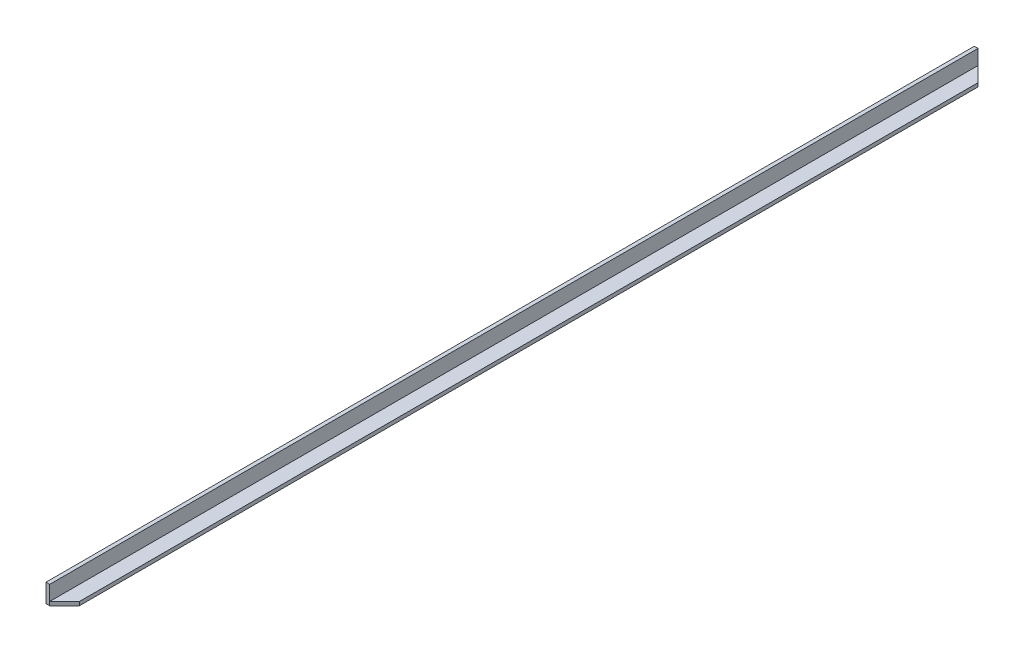
ISO-10303-21;
HEADER;
FILE_DESCRIPTION(('STEP AP214'),'2;1');
FILE_NAME('part.step','',(''),(''),'','','');
FILE_SCHEMA(('AUTOMOTIVE_DESIGN { 1 0 10303 214 1 1 1 1 }'));
ENDSEC;
DATA;
#1=APPLICATION_CONTEXT('core data for automotive mechanical design processes');
#2=APPLICATION_PROTOCOL_DEFINITION('international standard','automotive_design',2000,#1);
#3=PRODUCT_CONTEXT('',#1,'mechanical');
#4=PRODUCT('Part','Part','',(#3));
#5=PRODUCT_RELATED_PRODUCT_CATEGORY('part','',(#4));
#6=PRODUCT_DEFINITION_FORMATION('','',#4);
#7=PRODUCT_DEFINITION_CONTEXT('part definition',#1,'design');
#8=PRODUCT_DEFINITION('design','',#6,#7);
#9=PRODUCT_DEFINITION_SHAPE('','',#8);
#10=(LENGTH_UNIT() NAMED_UNIT(*) SI_UNIT(.MILLI.,.METRE.));
#11=(NAMED_UNIT(*) PLANE_ANGLE_UNIT() SI_UNIT($,.RADIAN.));
#12=(NAMED_UNIT(*) SI_UNIT($,.STERADIAN.) SOLID_ANGLE_UNIT());
#13=UNCERTAINTY_MEASURE_WITH_UNIT(LENGTH_MEASURE(1.E-05),#10,'distance_accuracy_value','');
#14=(GEOMETRIC_REPRESENTATION_CONTEXT(3) GLOBAL_UNCERTAINTY_ASSIGNED_CONTEXT((#13)) GLOBAL_UNIT_ASSIGNED_CONTEXT((#10,
#11,#12)) REPRESENTATION_CONTEXT('',''));
#15=CARTESIAN_POINT('',(0.,0.,0.));
#16=DIRECTION('',(0.,0.,1.));
#17=DIRECTION('',(1.,0.,0.));
#18=AXIS2_PLACEMENT_3D('',#15,#16,#17);
#19=CARTESIAN_POINT('',(-10.,0.,1000.));
#20=DIRECTION('',(1.,0.,0.));
#21=DIRECTION('',(0.,1.,0.));
#22=AXIS2_PLACEMENT_3D('',#19,#20,#21);
#23=PLANE('',#22);
#24=DIRECTION('',(0.,-1.,0.));
#25=VECTOR('',#24,1.);
#26=CARTESIAN_POINT('',(-10.,0.,0.));
#27=LINE('',#26,#25);
#28=CARTESIAN_POINT('',(-9.99999999999999,20.,0.));
#29=VERTEX_POINT('',#28);
#30=CARTESIAN_POINT('',(-10.,0.,0.));
#31=VERTEX_POINT('',#30);
#32=EDGE_CURVE('E133',#29,#31,#27,.T.);
#33=ORIENTED_EDGE('',*,*,#32,.T.);
#34=DIRECTION('',(0.,0.,-1.));
#35=VECTOR('',#34,1.);
#36=CARTESIAN_POINT('',(-10.,0.,1000.));
#37=LINE('',#36,#35);
#38=CARTESIAN_POINT('',(-10.,0.,1000.));
#39=VERTEX_POINT('',#38);
#40=EDGE_CURVE('E11',#39,#31,#37,.T.);
#41=ORIENTED_EDGE('',*,*,#40,.F.);
#42=DIRECTION('',(0.,-1.,0.));
#43=VECTOR('',#42,1.);
#44=CARTESIAN_POINT('',(-10.,0.,1000.));
#45=LINE('',#44,#43);
#46=CARTESIAN_POINT('',(-9.99999999999999,20.,1000.));
#47=VERTEX_POINT('',#46);
#48=EDGE_CURVE('E128',#47,#39,#45,.T.);
#49=ORIENTED_EDGE('',*,*,#48,.F.);
#50=DIRECTION('',(0.,0.,-1.));
#51=VECTOR('',#50,1.);
#52=CARTESIAN_POINT('',(-9.99999999999999,20.,1000.));
#53=LINE('',#52,#51);
#54=EDGE_CURVE('E125',#47,#29,#53,.T.);
#55=ORIENTED_EDGE('',*,*,#54,.T.);
#56=EDGE_LOOP('',(#33,#41,#49,#55));
#57=FACE_BOUND('',#56,.T.);
#58=ADVANCED_FACE('F33',(#57),#23,.F.);
#59=CARTESIAN_POINT('',(-10.,0.,1000.));
#60=DIRECTION('',(0.,1.,0.));
#61=DIRECTION('',(-1.,0.,0.));
#62=AXIS2_PLACEMENT_3D('',#59,#60,#61);
#63=PLANE('',#62);
#64=DIRECTION('',(0.,0.,-1.));
#65=VECTOR('',#64,1.);
#66=CARTESIAN_POINT('',(10.,0.,1000.));
#67=LINE('',#66,#65);
#68=CARTESIAN_POINT('',(10.,0.,984.));
#69=VERTEX_POINT('',#68);
#70=CARTESIAN_POINT('',(10.,0.,16.));
#71=VERTEX_POINT('',#70);
#72=EDGE_CURVE('E40',#69,#71,#67,.T.);
#73=ORIENTED_EDGE('',*,*,#72,.F.);
#74=DIRECTION('',(-0.707106781186547,0.,0.707106781186548));
#75=VECTOR('',#74,1.);
#76=CARTESIAN_POINT('',(-6.,0.,1000.));
#77=LINE('',#76,#75);
#78=CARTESIAN_POINT('',(-6.,0.,1000.));
#79=VERTEX_POINT('',#78);
#80=EDGE_CURVE('E100',#69,#79,#77,.T.);
#81=ORIENTED_EDGE('',*,*,#80,.T.);
#82=DIRECTION('',(1.,0.,0.));
#83=VECTOR('',#82,1.);
#84=CARTESIAN_POINT('',(-10.,0.,1000.));
#85=LINE('',#84,#83);
#86=EDGE_CURVE('E81',#39,#79,#85,.T.);
#87=ORIENTED_EDGE('',*,*,#86,.F.);
#88=ORIENTED_EDGE('',*,*,#40,.T.);
#89=DIRECTION('',(1.,0.,0.));
#90=VECTOR('',#89,1.);
#91=CARTESIAN_POINT('',(-10.,0.,0.));
#92=LINE('',#91,#90);
#93=CARTESIAN_POINT('',(-6.,0.,0.));
#94=VERTEX_POINT('',#93);
#95=EDGE_CURVE('E131',#31,#94,#92,.T.);
#96=ORIENTED_EDGE('',*,*,#95,.T.);
#97=DIRECTION('',(0.707106781186548,0.,0.707106781186548));
#98=VECTOR('',#97,1.);
#99=CARTESIAN_POINT('',(-6.,0.,0.));
#100=LINE('',#99,#98);
#101=EDGE_CURVE('E47',#94,#71,#100,.T.);
#102=ORIENTED_EDGE('',*,*,#101,.T.);
#103=EDGE_LOOP('',(#73,#81,#87,#88,#96,#102));
#104=FACE_BOUND('',#103,.T.);
#105=ADVANCED_FACE('F116',(#104),#63,.F.);
#106=CARTESIAN_POINT('',(10.,4.,1000.));
#107=DIRECTION('',(-1.,0.,0.));
#108=DIRECTION('',(0.,0.,1.));
#109=AXIS2_PLACEMENT_3D('',#106,#107,#108);
#110=PLANE('',#109);
#111=DIRECTION('',(0.,0.,-1.));
#112=VECTOR('',#111,1.);
#113=CARTESIAN_POINT('',(10.,4.,1000.));
#114=LINE('',#113,#112);
#115=CARTESIAN_POINT('',(10.,4.,984.));
#116=VERTEX_POINT('',#115);
#117=CARTESIAN_POINT('',(10.,4.,16.));
#118=VERTEX_POINT('',#117);
#119=EDGE_CURVE('E114',#116,#118,#114,.T.);
#120=ORIENTED_EDGE('',*,*,#119,.F.);
#121=DIRECTION('',(0.,1.,0.));
#122=VECTOR('',#121,1.);
#123=CARTESIAN_POINT('',(10.,0.,984.));
#124=LINE('',#123,#122);
#125=EDGE_CURVE('E103',#69,#116,#124,.T.);
#126=ORIENTED_EDGE('',*,*,#125,.F.);
#127=ORIENTED_EDGE('',*,*,#72,.T.);
#128=DIRECTION('',(0.,1.,0.));
#129=VECTOR('',#128,1.);
#130=CARTESIAN_POINT('',(10.,0.,16.));
#131=LINE('',#130,#129);
#132=EDGE_CURVE('E136',#71,#118,#131,.T.);
#133=ORIENTED_EDGE('',*,*,#132,.T.);
#134=EDGE_LOOP('',(#120,#126,#127,#133));
#135=FACE_BOUND('',#134,.T.);
#136=ADVANCED_FACE('F112',(#135),#110,.F.);
#137=CARTESIAN_POINT('',(-6.,4.,1000.));
#138=DIRECTION('',(0.,-1.,0.));
#139=DIRECTION('',(0.,0.,-1.));
#140=AXIS2_PLACEMENT_3D('',#137,#138,#139);
#141=PLANE('',#140);
#142=DIRECTION('',(0.,0.,-1.));
#143=VECTOR('',#142,1.);
#144=CARTESIAN_POINT('',(-6.,4.,1000.));
#145=LINE('',#144,#143);
#146=CARTESIAN_POINT('',(-6.,4.,1000.));
#147=VERTEX_POINT('',#146);
#148=CARTESIAN_POINT('',(-6.,4.,0.));
#149=VERTEX_POINT('',#148);
#150=EDGE_CURVE('E118',#147,#149,#145,.T.);
#151=ORIENTED_EDGE('',*,*,#150,.F.);
#152=DIRECTION('',(-0.707106781186547,0.,0.707106781186548));
#153=VECTOR('',#152,1.);
#154=CARTESIAN_POINT('',(-6.,4.,1000.));
#155=LINE('',#154,#153);
#156=EDGE_CURVE('E108',#116,#147,#155,.T.);
#157=ORIENTED_EDGE('',*,*,#156,.F.);
#158=ORIENTED_EDGE('',*,*,#119,.T.);
#159=DIRECTION('',(0.707106781186548,0.,0.707106781186548));
#160=VECTOR('',#159,1.);
#161=CARTESIAN_POINT('',(-6.,4.,0.));
#162=LINE('',#161,#160);
#163=EDGE_CURVE('E145',#149,#118,#162,.T.);
#164=ORIENTED_EDGE('',*,*,#163,.F.);
#165=EDGE_LOOP('',(#151,#157,#158,#164));
#166=FACE_BOUND('',#165,.T.);
#167=ADVANCED_FACE('F156',(#166),#141,.F.);
#168=CARTESIAN_POINT('',(-6.,20.,1000.));
#169=DIRECTION('',(-1.,0.,0.));
#170=DIRECTION('',(0.,0.,1.));
#171=AXIS2_PLACEMENT_3D('',#168,#169,#170);
#172=PLANE('',#171);
#173=DIRECTION('',(0.,1.,0.));
#174=VECTOR('',#173,1.);
#175=CARTESIAN_POINT('',(-6.,20.,0.));
#176=LINE('',#175,#174);
#177=CARTESIAN_POINT('',(-6.,20.,0.));
#178=VERTEX_POINT('',#177);
#179=EDGE_CURVE('E129',#149,#178,#176,.T.);
#180=ORIENTED_EDGE('',*,*,#179,.T.);
#181=DIRECTION('',(0.,0.,-1.));
#182=VECTOR('',#181,1.);
#183=CARTESIAN_POINT('',(-6.,20.,1000.));
#184=LINE('',#183,#182);
#185=CARTESIAN_POINT('',(-6.,20.,1000.));
#186=VERTEX_POINT('',#185);
#187=EDGE_CURVE('E123',#186,#178,#184,.T.);
#188=ORIENTED_EDGE('',*,*,#187,.F.);
#189=DIRECTION('',(0.,1.,0.));
#190=VECTOR('',#189,1.);
#191=CARTESIAN_POINT('',(-6.,20.,1000.));
#192=LINE('',#191,#190);
#193=EDGE_CURVE('E138',#147,#186,#192,.T.);
#194=ORIENTED_EDGE('',*,*,#193,.F.);
#195=ORIENTED_EDGE('',*,*,#150,.T.);
#196=EDGE_LOOP('',(#180,#188,#194,#195));
#197=FACE_BOUND('',#196,.T.);
#198=ADVANCED_FACE('F159',(#197),#172,.F.);
#199=CARTESIAN_POINT('',(-9.99999999999999,20.,1000.));
#200=DIRECTION('',(0.,-1.,0.));
#201=DIRECTION('',(1.,0.,0.));
#202=AXIS2_PLACEMENT_3D('',#199,#200,#201);
#203=PLANE('',#202);
#204=DIRECTION('',(-1.,0.,0.));
#205=VECTOR('',#204,1.);
#206=CARTESIAN_POINT('',(-9.99999999999999,20.,0.));
#207=LINE('',#206,#205);
#208=EDGE_CURVE('E74',#178,#29,#207,.T.);
#209=ORIENTED_EDGE('',*,*,#208,.T.);
#210=ORIENTED_EDGE('',*,*,#54,.F.);
#211=DIRECTION('',(-1.,0.,0.));
#212=VECTOR('',#211,1.);
#213=CARTESIAN_POINT('',(-9.99999999999999,20.,1000.));
#214=LINE('',#213,#212);
#215=EDGE_CURVE('E56',#186,#47,#214,.T.);
#216=ORIENTED_EDGE('',*,*,#215,.F.);
#217=ORIENTED_EDGE('',*,*,#187,.T.);
#218=EDGE_LOOP('',(#209,#210,#216,#217));
#219=FACE_BOUND('',#218,.T.);
#220=ADVANCED_FACE('F160',(#219),#203,.F.);
#221=CARTESIAN_POINT('',(0.,0.,1000.));
#222=DIRECTION('',(0.,0.,-1.));
#223=DIRECTION('',(-1.,0.,0.));
#224=AXIS2_PLACEMENT_3D('',#221,#222,#223);
#225=PLANE('',#224);
#226=ORIENTED_EDGE('',*,*,#86,.T.);
#227=DIRECTION('',(0.,1.,0.));
#228=VECTOR('',#227,1.);
#229=CARTESIAN_POINT('',(-6.,0.,1000.));
#230=LINE('',#229,#228);
#231=EDGE_CURVE('E106',#79,#147,#230,.T.);
#232=ORIENTED_EDGE('',*,*,#231,.T.);
#233=ORIENTED_EDGE('',*,*,#193,.T.);
#234=ORIENTED_EDGE('',*,*,#215,.T.);
#235=ORIENTED_EDGE('',*,*,#48,.T.);
#236=EDGE_LOOP('',(#226,#232,#233,#234,#235));
#237=FACE_BOUND('',#236,.T.);
#238=ADVANCED_FACE('F152',(#237),#225,.F.);
#239=CARTESIAN_POINT('',(0.,0.,0.));
#240=DIRECTION('',(0.,0.,-1.));
#241=DIRECTION('',(-1.,0.,0.));
#242=AXIS2_PLACEMENT_3D('',#239,#240,#241);
#243=PLANE('',#242);
#244=DIRECTION('',(0.,1.,0.));
#245=VECTOR('',#244,1.);
#246=CARTESIAN_POINT('',(-6.,0.,0.));
#247=LINE('',#246,#245);
#248=EDGE_CURVE('E142',#94,#149,#247,.T.);
#249=ORIENTED_EDGE('',*,*,#248,.F.);
#250=ORIENTED_EDGE('',*,*,#95,.F.);
#251=ORIENTED_EDGE('',*,*,#32,.F.);
#252=ORIENTED_EDGE('',*,*,#208,.F.);
#253=ORIENTED_EDGE('',*,*,#179,.F.);
#254=EDGE_LOOP('',(#249,#250,#251,#252,#253));
#255=FACE_BOUND('',#254,.T.);
#256=ADVANCED_FACE('F166',(#255),#243,.T.);
#257=CARTESIAN_POINT('',(-6.,0.,0.));
#258=DIRECTION('',(-0.707106781186547,0.,0.707106781186547));
#259=DIRECTION('',(0.707106781186548,0.,0.707106781186548));
#260=AXIS2_PLACEMENT_3D('',#257,#258,#259);
#261=PLANE('',#260);
#262=ORIENTED_EDGE('',*,*,#163,.T.);
#263=ORIENTED_EDGE('',*,*,#132,.F.);
#264=ORIENTED_EDGE('',*,*,#101,.F.);
#265=ORIENTED_EDGE('',*,*,#248,.T.);
#266=EDGE_LOOP('',(#262,#263,#264,#265));
#267=FACE_BOUND('',#266,.T.);
#268=ADVANCED_FACE('F167',(#267),#261,.F.);
#269=CARTESIAN_POINT('',(-6.,0.,1000.));
#270=DIRECTION('',(-0.707106781186548,0.,-0.707106781186547));
#271=DIRECTION('',(-0.707106781186547,0.,0.707106781186548));
#272=AXIS2_PLACEMENT_3D('',#269,#270,#271);
#273=PLANE('',#272);
#274=ORIENTED_EDGE('',*,*,#156,.T.);
#275=ORIENTED_EDGE('',*,*,#231,.F.);
#276=ORIENTED_EDGE('',*,*,#80,.F.);
#277=ORIENTED_EDGE('',*,*,#125,.T.);
#278=EDGE_LOOP('',(#274,#275,#276,#277));
#279=FACE_BOUND('',#278,.T.);
#280=ADVANCED_FACE('F102',(#279),#273,.F.);
#281=CLOSED_SHELL('',(#58,#105,#136,#167,#198,#220,#238,#256,#268,#280));
#282=MANIFOLD_SOLID_BREP('B2',#281);
#283=ADVANCED_BREP_SHAPE_REPRESENTATION('',(#18,#282),#14);
#284=SHAPE_DEFINITION_REPRESENTATION(#9,#283);
ENDSEC;
END-ISO-10303-21;
